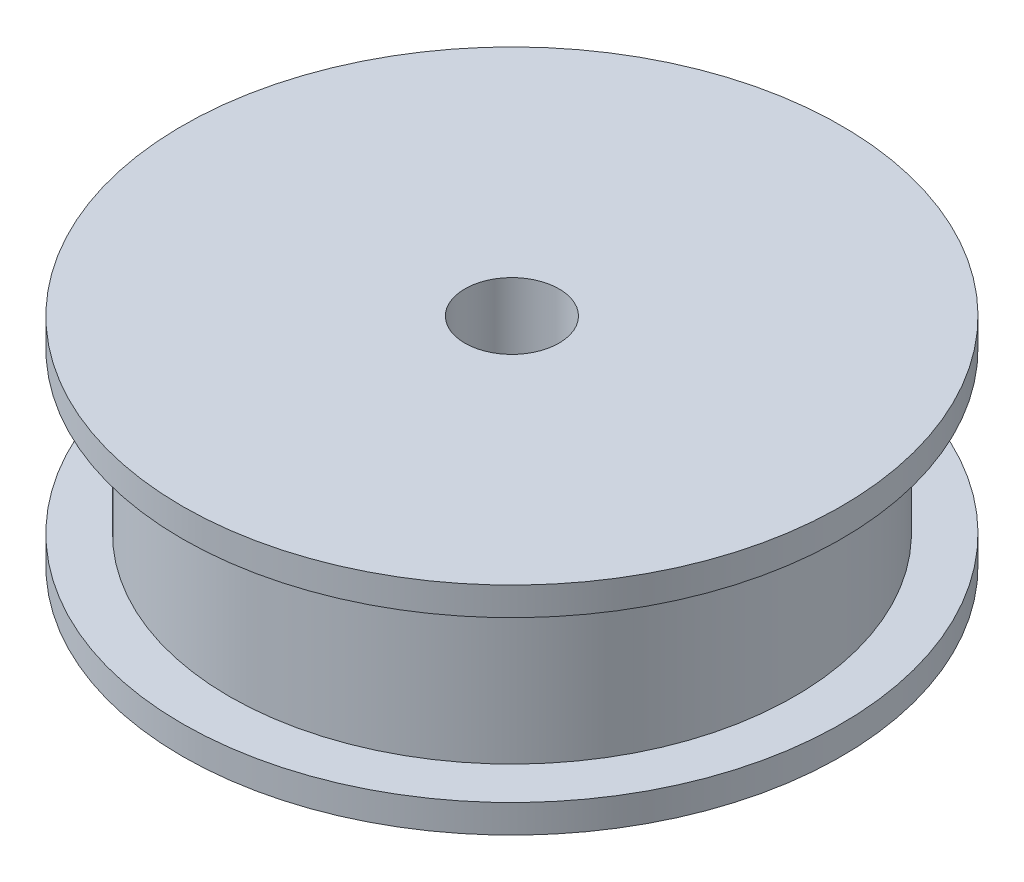
ISO-10303-21;
HEADER;
FILE_DESCRIPTION(('STEP AP214'),'2;1');
FILE_NAME('part.step','',(''),(''),'','','');
FILE_SCHEMA(('AUTOMOTIVE_DESIGN { 1 0 10303 214 1 1 1 1 }'));
ENDSEC;
DATA;
#1=APPLICATION_CONTEXT('core data for automotive mechanical design processes');
#2=APPLICATION_PROTOCOL_DEFINITION('international standard','automotive_design',2000,#1);
#3=PRODUCT_CONTEXT('',#1,'mechanical');
#4=PRODUCT('Part','Part','',(#3));
#5=PRODUCT_RELATED_PRODUCT_CATEGORY('part','',(#4));
#6=PRODUCT_DEFINITION_FORMATION('','',#4);
#7=PRODUCT_DEFINITION_CONTEXT('part definition',#1,'design');
#8=PRODUCT_DEFINITION('design','',#6,#7);
#9=PRODUCT_DEFINITION_SHAPE('','',#8);
#10=(LENGTH_UNIT() NAMED_UNIT(*) SI_UNIT(.MILLI.,.METRE.));
#11=(NAMED_UNIT(*) PLANE_ANGLE_UNIT() SI_UNIT($,.RADIAN.));
#12=(NAMED_UNIT(*) SI_UNIT($,.STERADIAN.) SOLID_ANGLE_UNIT());
#13=UNCERTAINTY_MEASURE_WITH_UNIT(LENGTH_MEASURE(1.E-05),#10,'distance_accuracy_value','');
#14=(GEOMETRIC_REPRESENTATION_CONTEXT(3) GLOBAL_UNCERTAINTY_ASSIGNED_CONTEXT((#13)) GLOBAL_UNIT_ASSIGNED_CONTEXT((#10,
#11,#12)) REPRESENTATION_CONTEXT('',''));
#15=CARTESIAN_POINT('',(0.,0.,0.));
#16=DIRECTION('',(0.,0.,1.));
#17=DIRECTION('',(1.,0.,0.));
#18=AXIS2_PLACEMENT_3D('',#15,#16,#17);
#19=CARTESIAN_POINT('',(0.,5.,0.));
#20=DIRECTION('',(0.,-1.,0.));
#21=DIRECTION('',(0.,0.,-1.));
#22=AXIS2_PLACEMENT_3D('',#19,#20,#21);
#23=CYLINDRICAL_SURFACE('',#22,15.);
#24=CARTESIAN_POINT('',(0.,-3.5,0.));
#25=DIRECTION('',(0.,1.,0.));
#26=DIRECTION('',(0.,0.,1.));
#27=AXIS2_PLACEMENT_3D('',#24,#25,#26);
#28=CIRCLE('',#27,15.);
#29=CARTESIAN_POINT('',(0.,-3.5,15.));
#30=VERTEX_POINT('',#29);
#31=EDGE_CURVE('E49',#30,#30,#28,.T.);
#32=ORIENTED_EDGE('',*,*,#31,.T.);
#33=EDGE_LOOP('',(#32));
#34=FACE_BOUND('',#33,.T.);
#35=CARTESIAN_POINT('',(0.,5.,0.));
#36=DIRECTION('',(0.,1.,0.));
#37=DIRECTION('',(0.,0.,1.));
#38=AXIS2_PLACEMENT_3D('',#35,#36,#37);
#39=CIRCLE('',#38,15.);
#40=CARTESIAN_POINT('',(0.,5.,15.));
#41=VERTEX_POINT('',#40);
#42=EDGE_CURVE('E10',#41,#41,#39,.T.);
#43=ORIENTED_EDGE('',*,*,#42,.F.);
#44=EDGE_LOOP('',(#43));
#45=FACE_BOUND('',#44,.T.);
#46=ADVANCED_FACE('F34',(#34,#45),#23,.T.);
#47=CARTESIAN_POINT('',(0.,6.5,0.));
#48=DIRECTION('',(0.,-1.,0.));
#49=DIRECTION('',(0.,0.,-1.));
#50=AXIS2_PLACEMENT_3D('',#47,#48,#49);
#51=CYLINDRICAL_SURFACE('',#50,17.5);
#52=CARTESIAN_POINT('',(0.,6.5,0.));
#53=DIRECTION('',(0.,1.,0.));
#54=DIRECTION('',(0.,0.,1.));
#55=AXIS2_PLACEMENT_3D('',#52,#53,#54);
#56=CIRCLE('',#55,17.5);
#57=CARTESIAN_POINT('',(0.,6.5,17.5));
#58=VERTEX_POINT('',#57);
#59=EDGE_CURVE('E41',#58,#58,#56,.T.);
#60=ORIENTED_EDGE('',*,*,#59,.F.);
#61=EDGE_LOOP('',(#60));
#62=FACE_BOUND('',#61,.T.);
#63=CARTESIAN_POINT('',(0.,5.,0.));
#64=DIRECTION('',(0.,1.,0.));
#65=DIRECTION('',(0.,0.,1.));
#66=AXIS2_PLACEMENT_3D('',#63,#64,#65);
#67=CIRCLE('',#66,17.5);
#68=CARTESIAN_POINT('',(0.,5.,17.5));
#69=VERTEX_POINT('',#68);
#70=EDGE_CURVE('E46',#69,#69,#67,.T.);
#71=ORIENTED_EDGE('',*,*,#70,.T.);
#72=EDGE_LOOP('',(#71));
#73=FACE_BOUND('',#72,.T.);
#74=ADVANCED_FACE('F82',(#62,#73),#51,.T.);
#75=CARTESIAN_POINT('',(0.,6.5,0.));
#76=DIRECTION('',(0.,1.,0.));
#77=DIRECTION('',(0.,0.,1.));
#78=AXIS2_PLACEMENT_3D('',#75,#76,#77);
#79=PLANE('',#78);
#80=CARTESIAN_POINT('',(0.,6.5,0.));
#81=DIRECTION('',(0.,1.,0.));
#82=DIRECTION('',(0.,0.,1.));
#83=AXIS2_PLACEMENT_3D('',#80,#81,#82);
#84=CIRCLE('',#83,2.5);
#85=CARTESIAN_POINT('',(0.,6.5,2.5));
#86=VERTEX_POINT('',#85);
#87=EDGE_CURVE('E63',#86,#86,#84,.T.);
#88=ORIENTED_EDGE('',*,*,#87,.F.);
#89=EDGE_LOOP('',(#88));
#90=FACE_BOUND('',#89,.T.);
#91=ORIENTED_EDGE('',*,*,#59,.T.);
#92=EDGE_LOOP('',(#91));
#93=FACE_BOUND('',#92,.T.);
#94=ADVANCED_FACE('F86',(#90,#93),#79,.T.);
#95=CARTESIAN_POINT('',(0.,5.,0.));
#96=DIRECTION('',(0.,1.,0.));
#97=DIRECTION('',(0.,0.,1.));
#98=AXIS2_PLACEMENT_3D('',#95,#96,#97);
#99=PLANE('',#98);
#100=ORIENTED_EDGE('',*,*,#42,.T.);
#101=EDGE_LOOP('',(#100));
#102=FACE_BOUND('',#101,.T.);
#103=ORIENTED_EDGE('',*,*,#70,.F.);
#104=EDGE_LOOP('',(#103));
#105=FACE_BOUND('',#104,.T.);
#106=ADVANCED_FACE('F93',(#102,#105),#99,.F.);
#107=CARTESIAN_POINT('',(0.,-3.5,0.));
#108=DIRECTION('',(0.,-1.,0.));
#109=DIRECTION('',(0.,0.,-1.));
#110=AXIS2_PLACEMENT_3D('',#107,#108,#109);
#111=CYLINDRICAL_SURFACE('',#110,17.5);
#112=CARTESIAN_POINT('',(0.,-3.5,0.));
#113=DIRECTION('',(0.,1.,0.));
#114=DIRECTION('',(0.,0.,1.));
#115=AXIS2_PLACEMENT_3D('',#112,#113,#114);
#116=CIRCLE('',#115,17.5);
#117=CARTESIAN_POINT('',(0.,-3.5,17.5));
#118=VERTEX_POINT('',#117);
#119=EDGE_CURVE('E51',#118,#118,#116,.T.);
#120=ORIENTED_EDGE('',*,*,#119,.F.);
#121=EDGE_LOOP('',(#120));
#122=FACE_BOUND('',#121,.T.);
#123=CARTESIAN_POINT('',(0.,-5.,0.));
#124=DIRECTION('',(0.,1.,0.));
#125=DIRECTION('',(0.,0.,1.));
#126=AXIS2_PLACEMENT_3D('',#123,#124,#125);
#127=CIRCLE('',#126,17.5);
#128=CARTESIAN_POINT('',(0.,-5.,17.5));
#129=VERTEX_POINT('',#128);
#130=EDGE_CURVE('E56',#129,#129,#127,.T.);
#131=ORIENTED_EDGE('',*,*,#130,.T.);
#132=EDGE_LOOP('',(#131));
#133=FACE_BOUND('',#132,.T.);
#134=ADVANCED_FACE('F100',(#122,#133),#111,.T.);
#135=CARTESIAN_POINT('',(0.,-3.5,0.));
#136=DIRECTION('',(0.,1.,0.));
#137=DIRECTION('',(0.,0.,1.));
#138=AXIS2_PLACEMENT_3D('',#135,#136,#137);
#139=PLANE('',#138);
#140=ORIENTED_EDGE('',*,*,#31,.F.);
#141=EDGE_LOOP('',(#140));
#142=FACE_BOUND('',#141,.T.);
#143=ORIENTED_EDGE('',*,*,#119,.T.);
#144=EDGE_LOOP('',(#143));
#145=FACE_BOUND('',#144,.T.);
#146=ADVANCED_FACE('F79',(#142,#145),#139,.T.);
#147=CARTESIAN_POINT('',(0.,-5.,0.));
#148=DIRECTION('',(0.,1.,0.));
#149=DIRECTION('',(0.,0.,1.));
#150=AXIS2_PLACEMENT_3D('',#147,#148,#149);
#151=PLANE('',#150);
#152=CARTESIAN_POINT('',(0.,-5.,0.));
#153=DIRECTION('',(0.,1.,0.));
#154=DIRECTION('',(0.,0.,1.));
#155=AXIS2_PLACEMENT_3D('',#152,#153,#154);
#156=CIRCLE('',#155,2.5);
#157=CARTESIAN_POINT('',(0.,-5.,2.5));
#158=VERTEX_POINT('',#157);
#159=EDGE_CURVE('E37',#158,#158,#156,.T.);
#160=ORIENTED_EDGE('',*,*,#159,.T.);
#161=EDGE_LOOP('',(#160));
#162=FACE_BOUND('',#161,.T.);
#163=ORIENTED_EDGE('',*,*,#130,.F.);
#164=EDGE_LOOP('',(#163));
#165=FACE_BOUND('',#164,.T.);
#166=ADVANCED_FACE('F70',(#162,#165),#151,.F.);
#167=CARTESIAN_POINT('',(0.,-6.5,0.));
#168=DIRECTION('',(0.,1.,0.));
#169=DIRECTION('',(0.,0.,1.));
#170=AXIS2_PLACEMENT_3D('',#167,#168,#169);
#171=CYLINDRICAL_SURFACE('',#170,2.5);
#172=CARTESIAN_POINT('',(0.,6.5,2.5));
#173=CARTESIAN_POINT('',(0.,6.38020833333333,2.5));
#174=CARTESIAN_POINT('',(0.,6.26041666666667,2.5));
#175=CARTESIAN_POINT('',(0.,6.02083333333333,2.5));
#176=CARTESIAN_POINT('',(0.,5.90104166666667,2.5));
#177=CARTESIAN_POINT('',(0.,5.66145833333333,2.5));
#178=CARTESIAN_POINT('',(0.,5.54166666666667,2.5));
#179=CARTESIAN_POINT('',(0.,5.30208333333333,2.5));
#180=CARTESIAN_POINT('',(0.,5.18229166666667,2.5));
#181=CARTESIAN_POINT('',(0.,4.94270833333333,2.5));
#182=CARTESIAN_POINT('',(0.,4.82291666666667,2.5));
#183=CARTESIAN_POINT('',(0.,4.58333333333333,2.5));
#184=CARTESIAN_POINT('',(0.,4.46354166666667,2.5));
#185=CARTESIAN_POINT('',(0.,4.22395833333333,2.5));
#186=CARTESIAN_POINT('',(0.,4.10416666666667,2.5));
#187=CARTESIAN_POINT('',(0.,3.86458333333333,2.5));
#188=CARTESIAN_POINT('',(0.,3.74479166666667,2.5));
#189=CARTESIAN_POINT('',(0.,3.50520833333333,2.5));
#190=CARTESIAN_POINT('',(0.,3.38541666666667,2.5));
#191=CARTESIAN_POINT('',(0.,3.14583333333333,2.5));
#192=CARTESIAN_POINT('',(0.,3.02604166666667,2.5));
#193=CARTESIAN_POINT('',(0.,2.78645833333333,2.5));
#194=CARTESIAN_POINT('',(0.,2.66666666666667,2.5));
#195=CARTESIAN_POINT('',(0.,2.42708333333333,2.5));
#196=CARTESIAN_POINT('',(0.,2.30729166666667,2.5));
#197=CARTESIAN_POINT('',(0.,2.06770833333333,2.5));
#198=CARTESIAN_POINT('',(0.,1.94791666666667,2.5));
#199=CARTESIAN_POINT('',(0.,1.70833333333333,2.5));
#200=CARTESIAN_POINT('',(0.,1.58854166666667,2.5));
#201=CARTESIAN_POINT('',(0.,1.34895833333333,2.5));
#202=CARTESIAN_POINT('',(0.,1.22916666666667,2.5));
#203=CARTESIAN_POINT('',(0.,0.989583333333333,2.5));
#204=CARTESIAN_POINT('',(0.,0.869791666666667,2.5));
#205=CARTESIAN_POINT('',(0.,0.630208333333333,2.5));
#206=CARTESIAN_POINT('',(0.,0.510416666666666,2.5));
#207=CARTESIAN_POINT('',(0.,0.270833333333333,2.5));
#208=CARTESIAN_POINT('',(0.,0.151041666666667,2.5));
#209=CARTESIAN_POINT('',(0.,-0.0885416666666668,2.5));
#210=CARTESIAN_POINT('',(0.,-0.208333333333334,2.5));
#211=CARTESIAN_POINT('',(0.,-0.447916666666667,2.5));
#212=CARTESIAN_POINT('',(0.,-0.567708333333334,2.5));
#213=CARTESIAN_POINT('',(0.,-0.807291666666667,2.5));
#214=CARTESIAN_POINT('',(0.,-0.927083333333334,2.5));
#215=CARTESIAN_POINT('',(0.,-1.16666666666667,2.5));
#216=CARTESIAN_POINT('',(0.,-1.28645833333333,2.5));
#217=CARTESIAN_POINT('',(0.,-1.52604166666667,2.5));
#218=CARTESIAN_POINT('',(0.,-1.64583333333333,2.5));
#219=CARTESIAN_POINT('',(0.,-1.88541666666667,2.5));
#220=CARTESIAN_POINT('',(0.,-2.00520833333333,2.5));
#221=CARTESIAN_POINT('',(0.,-2.24479166666667,2.5));
#222=CARTESIAN_POINT('',(0.,-2.36458333333333,2.5));
#223=CARTESIAN_POINT('',(0.,-2.60416666666667,2.5));
#224=CARTESIAN_POINT('',(0.,-2.72395833333333,2.5));
#225=CARTESIAN_POINT('',(0.,-2.96354166666667,2.5));
#226=CARTESIAN_POINT('',(0.,-3.08333333333333,2.5));
#227=CARTESIAN_POINT('',(0.,-3.32291666666667,2.5));
#228=CARTESIAN_POINT('',(0.,-3.44270833333333,2.5));
#229=CARTESIAN_POINT('',(0.,-3.68229166666667,2.5));
#230=CARTESIAN_POINT('',(0.,-3.80208333333333,2.5));
#231=CARTESIAN_POINT('',(0.,-4.04166666666667,2.5));
#232=CARTESIAN_POINT('',(0.,-4.16145833333333,2.5));
#233=CARTESIAN_POINT('',(0.,-4.40104166666667,2.5));
#234=CARTESIAN_POINT('',(0.,-4.52083333333333,2.5));
#235=CARTESIAN_POINT('',(0.,-4.76041666666667,2.5));
#236=CARTESIAN_POINT('',(0.,-4.88020833333333,2.5));
#237=CARTESIAN_POINT('',(0.,-5.,2.5));
#238=B_SPLINE_CURVE_WITH_KNOTS('',3,(#172,#173,#174,#175,#176,#177,#178,#179,#180,#181,#182,
#183,#184,#185,#186,#187,#188,#189,#190,#191,#192,#193,#194,#195,#196,#197,#198,#199,#200,#201,
#202,#203,#204,#205,#206,#207,#208,#209,#210,#211,#212,#213,#214,#215,#216,#217,#218,#219,#220,
#221,#222,#223,#224,#225,#226,#227,#228,#229,#230,#231,#232,#233,#234,#235,#236,#237),
.UNSPECIFIED.,.F.,.F.,(4,2,2,2,2,2,2,2,2,2,2,2,2,2,2,2,2,2,2,2,2,2,2,2,2,2,2,2,2,2,2,2,4),(0.,
0.359375,0.718750000000001,1.078125,1.4375,1.796875,2.15625,2.515625,2.875,3.234375,3.59375,
3.953125,4.3125,4.671875,5.03125,5.390625,5.75,6.109375,6.46875,6.828125,7.1875,7.546875,
7.90625,8.265625,8.625,8.984375,9.34375,9.703125,10.0625,10.421875,10.78125,11.140625,11.5),.UNSPECIFIED.);
#239=EDGE_CURVE('BSEAM73',#86,#158,#238,.T.);
#240=ORIENTED_EDGE('',*,*,#87,.T.);
#241=ORIENTED_EDGE('',*,*,#159,.F.);
#242=ORIENTED_EDGE('',*,*,#239,.T.);
#243=ORIENTED_EDGE('',*,*,#239,.F.);
#244=EDGE_LOOP('',(#240,#242,#241,#243));
#245=FACE_BOUND('',#244,.T.);
#246=ADVANCED_FACE('F73',(#245),#171,.F.);
#247=CLOSED_SHELL('',(#46,#74,#94,#106,#134,#146,#166,#246));
#248=MANIFOLD_SOLID_BREP('B2',#247);
#249=ADVANCED_BREP_SHAPE_REPRESENTATION('',(#18,#248),#14);
#250=SHAPE_DEFINITION_REPRESENTATION(#9,#249);
ENDSEC;
END-ISO-10303-21;
